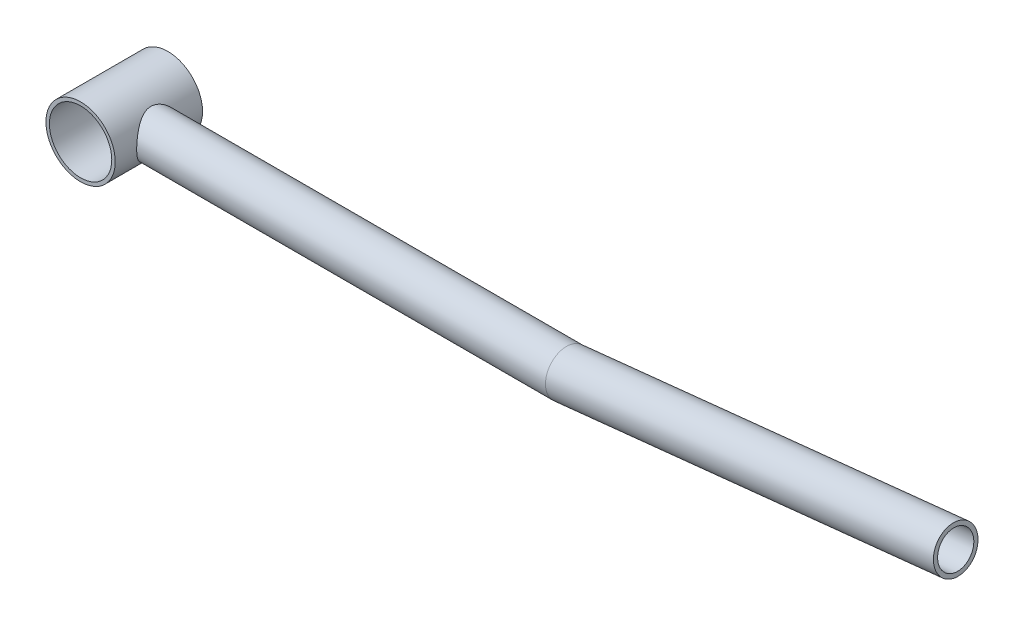
ISO-10303-21;
HEADER;
FILE_DESCRIPTION(('STEP AP214'),'2;1');
FILE_NAME('part.step','',(''),(''),'','','');
FILE_SCHEMA(('AUTOMOTIVE_DESIGN { 1 0 10303 214 1 1 1 1 }'));
ENDSEC;
DATA;
#1=APPLICATION_CONTEXT('core data for automotive mechanical design processes');
#2=APPLICATION_PROTOCOL_DEFINITION('international standard','automotive_design',2000,#1);
#3=PRODUCT_CONTEXT('',#1,'mechanical');
#4=PRODUCT('Part','Part','',(#3));
#5=PRODUCT_RELATED_PRODUCT_CATEGORY('part','',(#4));
#6=PRODUCT_DEFINITION_FORMATION('','',#4);
#7=PRODUCT_DEFINITION_CONTEXT('part definition',#1,'design');
#8=PRODUCT_DEFINITION('design','',#6,#7);
#9=PRODUCT_DEFINITION_SHAPE('','',#8);
#10=(LENGTH_UNIT() NAMED_UNIT(*) SI_UNIT(.MILLI.,.METRE.));
#11=(NAMED_UNIT(*) PLANE_ANGLE_UNIT() SI_UNIT($,.RADIAN.));
#12=(NAMED_UNIT(*) SI_UNIT($,.STERADIAN.) SOLID_ANGLE_UNIT());
#13=UNCERTAINTY_MEASURE_WITH_UNIT(LENGTH_MEASURE(1.E-05),#10,'distance_accuracy_value','');
#14=(GEOMETRIC_REPRESENTATION_CONTEXT(3) GLOBAL_UNCERTAINTY_ASSIGNED_CONTEXT((#13)) GLOBAL_UNIT_ASSIGNED_CONTEXT((#10,
#11,#12)) REPRESENTATION_CONTEXT('',''));
#15=CARTESIAN_POINT('',(0.,0.,0.));
#16=DIRECTION('',(0.,0.,1.));
#17=DIRECTION('',(1.,0.,0.));
#18=AXIS2_PLACEMENT_3D('',#15,#16,#17);
#19=CARTESIAN_POINT('',(0.,0.,-31.5));
#20=DIRECTION('',(0.,0.,1.));
#21=DIRECTION('',(1.,0.,0.));
#22=AXIS2_PLACEMENT_3D('',#19,#20,#21);
#23=CYLINDRICAL_SURFACE('',#22,22.5);
#24=CARTESIAN_POINT('',(0.,0.,-31.5));
#25=DIRECTION('',(0.,0.,1.));
#26=DIRECTION('',(1.,0.,0.));
#27=AXIS2_PLACEMENT_3D('',#24,#25,#26);
#28=CIRCLE('',#27,22.5);
#29=CARTESIAN_POINT('',(22.5,0.,-31.5));
#30=VERTEX_POINT('',#29);
#31=EDGE_CURVE('E67',#30,#30,#28,.T.);
#32=ORIENTED_EDGE('',*,*,#31,.F.);
#33=EDGE_LOOP('',(#32));
#34=FACE_BOUND('',#33,.T.);
#35=CARTESIAN_POINT('',(0.,0.,31.5));
#36=DIRECTION('',(0.,0.,1.));
#37=DIRECTION('',(1.,0.,0.));
#38=AXIS2_PLACEMENT_3D('',#35,#36,#37);
#39=CIRCLE('',#38,22.5);
#40=CARTESIAN_POINT('',(22.5,0.,31.5));
#41=VERTEX_POINT('',#40);
#42=EDGE_CURVE('E77',#41,#41,#39,.T.);
#43=ORIENTED_EDGE('',*,*,#42,.T.);
#44=EDGE_LOOP('',(#43));
#45=FACE_BOUND('',#44,.T.);
#46=ADVANCED_FACE('F65',(#34,#45),#23,.F.);
#47=CARTESIAN_POINT('',(0.,0.,31.5));
#48=DIRECTION('',(0.,0.,1.));
#49=DIRECTION('',(1.,0.,0.));
#50=AXIS2_PLACEMENT_3D('',#47,#48,#49);
#51=PLANE('',#50);
#52=CARTESIAN_POINT('',(0.,0.,31.5));
#53=DIRECTION('',(0.,0.,1.));
#54=DIRECTION('',(1.,0.,0.));
#55=AXIS2_PLACEMENT_3D('',#52,#53,#54);
#56=CIRCLE('',#55,25.);
#57=CARTESIAN_POINT('',(25.,0.,31.5));
#58=VERTEX_POINT('',#57);
#59=EDGE_CURVE('E74',#58,#58,#56,.T.);
#60=ORIENTED_EDGE('',*,*,#59,.T.);
#61=EDGE_LOOP('',(#60));
#62=FACE_BOUND('',#61,.T.);
#63=ORIENTED_EDGE('',*,*,#42,.F.);
#64=EDGE_LOOP('',(#63));
#65=FACE_BOUND('',#64,.T.);
#66=ADVANCED_FACE('F84',(#62,#65),#51,.T.);
#67=CARTESIAN_POINT('',(0.,0.,-31.5));
#68=DIRECTION('',(0.,0.,1.));
#69=DIRECTION('',(1.,0.,0.));
#70=AXIS2_PLACEMENT_3D('',#67,#68,#69);
#71=PLANE('',#70);
#72=ORIENTED_EDGE('',*,*,#31,.T.);
#73=EDGE_LOOP('',(#72));
#74=FACE_BOUND('',#73,.T.);
#75=CARTESIAN_POINT('',(0.,0.,-31.5));
#76=DIRECTION('',(0.,0.,1.));
#77=DIRECTION('',(1.,0.,0.));
#78=AXIS2_PLACEMENT_3D('',#75,#76,#77);
#79=CIRCLE('',#78,25.);
#80=CARTESIAN_POINT('',(25.,0.,-31.5));
#81=VERTEX_POINT('',#80);
#82=EDGE_CURVE('E12',#81,#81,#79,.T.);
#83=ORIENTED_EDGE('',*,*,#82,.F.);
#84=EDGE_LOOP('',(#83));
#85=FACE_BOUND('',#84,.T.);
#86=ADVANCED_FACE('F83',(#74,#85),#71,.F.);
#87=CARTESIAN_POINT('',(0.,0.,-31.5));
#88=DIRECTION('',(0.,0.,1.));
#89=DIRECTION('',(1.,0.,0.));
#90=AXIS2_PLACEMENT_3D('',#87,#88,#89);
#91=CYLINDRICAL_SURFACE('',#90,25.);
#92=ORIENTED_EDGE('',*,*,#59,.F.);
#93=EDGE_LOOP('',(#92));
#94=FACE_BOUND('',#93,.T.);
#95=ORIENTED_EDGE('',*,*,#82,.T.);
#96=EDGE_LOOP('',(#95));
#97=FACE_BOUND('',#96,.T.);
#98=ADVANCED_FACE('F95',(#94,#97),#91,.T.);
#99=CLOSED_SHELL('',(#46,#66,#86,#98));
#100=MANIFOLD_SOLID_BREP('B2',#99);
#101=CARTESIAN_POINT('',(0.,0.,-31.5));
#102=DIRECTION('',(0.,0.,1.));
#103=DIRECTION('',(1.,0.,0.));
#104=AXIS2_PLACEMENT_3D('',#101,#102,#103);
#105=CYLINDRICAL_SURFACE('',#104,25.);
#106=CARTESIAN_POINT('',(25.,0.,-16.));
#107=CARTESIAN_POINT('',(25.0000015619882,0.404925044071155,-16.0000018773157));
#108=CARTESIAN_POINT('',(24.990142097665,0.809832411815925,-15.9846099706385));
#109=CARTESIAN_POINT('',(24.9509510419688,1.61652618236299,-15.92326968288));
#110=CARTESIAN_POINT('',(24.9216122625561,2.01831137766445,-15.8773100220158));
#111=CARTESIAN_POINT('',(24.8441286420605,2.81604821037112,-15.7554098701401));
#112=CARTESIAN_POINT('',(24.7959565811092,3.21199053959218,-15.6794259832054));
#113=CARTESIAN_POINT('',(24.6819740036757,3.99456099671028,-15.4985408355827));
#114=CARTESIAN_POINT('',(24.6161648797958,4.38118985736234,-15.3936418579784));
#115=CARTESIAN_POINT('',(24.468785547579,5.14076609074118,-15.1568468243231));
#116=CARTESIAN_POINT('',(24.3872961899422,5.51377244407853,-15.025089059471));
#117=CARTESIAN_POINT('',(24.2100855842812,6.24609510158275,-14.7357159583602));
#118=CARTESIAN_POINT('',(24.114364104839,6.60541118302287,-14.5781002016396));
#119=CARTESIAN_POINT('',(23.9106324755014,7.30859986653979,-14.2385667901493));
#120=CARTESIAN_POINT('',(23.8026253610819,7.65247625422316,-14.0566551363675));
#121=CARTESIAN_POINT('',(23.5763254629354,8.32360019852906,-13.6699562899151));
#122=CARTESIAN_POINT('',(23.4580313681202,8.65084562706958,-13.4651661804078));
#123=CARTESIAN_POINT('',(23.2032751229575,9.31365412183653,-13.0164828623738));
#124=CARTESIAN_POINT('',(23.0661182340287,9.64771274316306,-12.7707619235136));
#125=CARTESIAN_POINT('',(22.7850064089794,10.2940617258666,-12.2557366535805));
#126=CARTESIAN_POINT('',(22.6410511668713,10.6063511058608,-11.9864312605261));
#127=CARTESIAN_POINT('',(22.3490022897849,11.2086687230747,-11.4252092234652));
#128=CARTESIAN_POINT('',(22.2009034973146,11.4986673651024,-11.1332635184821));
#129=CARTESIAN_POINT('',(21.9037344054836,12.0551203444099,-10.5282019106555));
#130=CARTESIAN_POINT('',(21.7546640715095,12.3215738378621,-10.2150852497817));
#131=CARTESIAN_POINT('',(21.4374499122155,12.8665793254927,-9.52219977657806));
#132=CARTESIAN_POINT('',(21.2696389657507,13.1413799496496,-9.1393143835168));
#133=CARTESIAN_POINT('',(20.9419379170098,13.6575524379486,-8.348316185452));
#134=CARTESIAN_POINT('',(20.7820494133894,13.8989175727052,-7.94019832587867));
#135=CARTESIAN_POINT('',(20.4759821659353,14.3459904698911,-7.10058524689527));
#136=CARTESIAN_POINT('',(20.3297848843603,14.5517467761611,-6.66912292284909));
#137=CARTESIAN_POINT('',(20.1252100289451,14.8320367864773,-6.00569055390516));
#138=CARTESIAN_POINT('',(20.0594794225192,14.9207331379766,-5.78186975362472));
#139=CARTESIAN_POINT('',(19.9336577942813,15.0884150598226,-5.32898189890081));
#140=CARTESIAN_POINT('',(19.8735682005868,15.16739817266,-5.09991353411017));
#141=CARTESIAN_POINT('',(19.7336948385013,15.3492623867947,-4.53055229253545));
#142=CARTESIAN_POINT('',(19.6575477076493,15.4464497728831,-4.1875138920204));
#143=CARTESIAN_POINT('',(19.521358473509,15.6182136002394,-3.49276536899717));
#144=CARTESIAN_POINT('',(19.4613122707708,15.6927957976356,-3.14105747877335));
#145=CARTESIAN_POINT('',(19.3594402998739,15.8183001813279,-2.43126972701606));
#146=CARTESIAN_POINT('',(19.3175916839816,15.8692520417559,-2.07319844663944));
#147=CARTESIAN_POINT('',(19.2535956523238,15.9468367737907,-1.35265801288986));
#148=CARTESIAN_POINT('',(19.231448454688,15.9734693761403,-0.990188810869154));
#149=CARTESIAN_POINT('',(19.2077129340946,16.0020035959886,-0.26246015615068));
#150=CARTESIAN_POINT('',(19.2061890356969,16.0038277150333,0.10280447537216));
#151=CARTESIAN_POINT('',(19.2239297577434,15.9825126443981,0.832091460399473));
#152=CARTESIAN_POINT('',(19.24319448145,15.9593733307183,1.19611380772419));
#153=CARTESIAN_POINT('',(19.3017467127909,15.8885074198918,1.92037328223284));
#154=CARTESIAN_POINT('',(19.3410485617405,15.8407632118421,2.28060750937627));
#155=CARTESIAN_POINT('',(19.4381624474468,15.7214419318028,2.99454239108447));
#156=CARTESIAN_POINT('',(19.4959748739967,15.6498643579324,3.34824290789736));
#157=CARTESIAN_POINT('',(19.6260739031015,15.4863735674023,4.03652558609995));
#158=CARTESIAN_POINT('',(19.6978709558272,15.3951393603922,4.37136256989055));
#159=CARTESIAN_POINT('',(19.8548252831694,15.1921818732877,5.03160397521626));
#160=CARTESIAN_POINT('',(19.9399877947337,15.0804505589621,5.35700463988336));
#161=CARTESIAN_POINT('',(20.2121658403417,14.7159808896165,6.31729900859783));
#162=CARTESIAN_POINT('',(20.415946958597,14.4338764142666,6.93665942019118));
#163=CARTESIAN_POINT('',(20.7627220180091,13.9270311591719,7.88670986628182));
#164=CARTESIAN_POINT('',(20.8971209302017,13.7249831568112,8.23315173665736));
#165=CARTESIAN_POINT('',(21.1722128751606,13.296696161189,8.90828480780034));
#166=CARTESIAN_POINT('',(21.3129064950319,13.0704549086854,9.23697434647771));
#167=CARTESIAN_POINT('',(21.5975435918726,12.5945655171766,9.87602455074263));
#168=CARTESIAN_POINT('',(21.741490387645,12.3448925721126,10.1863652117508));
#169=CARTESIAN_POINT('',(22.0295648350163,11.823159163581,10.7875537186817));
#170=CARTESIAN_POINT('',(22.1736924970079,11.5510973496357,11.0784003868203));
#171=CARTESIAN_POINT('',(22.4854503237815,10.9336594778248,11.6908990129197));
#172=CARTESIAN_POINT('',(22.6525676241315,10.5839664649272,12.0084814733917));
#173=CARTESIAN_POINT('',(22.9788334546104,9.85558430354046,12.6131505683738));
#174=CARTESIAN_POINT('',(23.1379806516688,9.47689033099584,12.9002321102804));
#175=CARTESIAN_POINT('',(23.4439951491246,8.6923014745235,13.4413788795508));
#176=CARTESIAN_POINT('',(23.5908728474814,8.28643015897211,13.695472166599));
#177=CARTESIAN_POINT('',(23.7989867549893,7.65877791158844,14.0499422909588));
#178=CARTESIAN_POINT('',(23.8663204968941,7.44643333273027,14.1636478233454));
#179=CARTESIAN_POINT('',(23.9964832307619,7.01565570471913,14.3818943973732));
#180=CARTESIAN_POINT('',(24.0593110591769,6.79722110303667,14.4864330734262));
#181=CARTESIAN_POINT('',(24.2163596379815,6.22117702909597,14.7461292462035));
#182=CARTESIAN_POINT('',(24.3066645830134,5.85907262264252,14.8937970331853));
#183=CARTESIAN_POINT('',(24.472571043401,5.12210088957013,15.1630462524395));
#184=CARTESIAN_POINT('',(24.5481752064179,4.74723587549779,15.2846323825156));
#185=CARTESIAN_POINT('',(24.6830408717459,3.98702789616474,15.5003093339703));
#186=CARTESIAN_POINT('',(24.7423124565402,3.60169155725471,15.5944171205238));
#187=CARTESIAN_POINT('',(24.8432233011495,2.82284294906272,15.7540335011103));
#188=CARTESIAN_POINT('',(24.8848622338729,2.42933052825373,15.8195415646094));
#189=CARTESIAN_POINT('',(24.9496239299749,1.63564062619806,15.9212210484698));
#190=CARTESIAN_POINT('',(24.9726833167174,1.23544504541874,15.9572920615261));
#191=CARTESIAN_POINT('',(24.999477761314,0.432822676299672,15.9991921444795));
#192=CARTESIAN_POINT('',(25.003212815007,0.0303958874795025,16.0050212078647));
#193=CARTESIAN_POINT('',(24.9912650807508,-0.773483996299121,15.9863498172394));
#194=CARTESIAN_POINT('',(24.9755811323802,-1.17493703163257,15.9618475507195));
#195=CARTESIAN_POINT('',(24.9251836971058,-1.97366097901498,15.8828746268655));
#196=CARTESIAN_POINT('',(24.8904707030591,-2.37093199910756,15.8284047456999));
#197=CARTESIAN_POINT('',(24.8052000041332,-3.13731209509082,15.6939634497678));
#198=CARTESIAN_POINT('',(24.7555850388601,-3.5067938890072,15.6155053701039));
#199=CARTESIAN_POINT('',(24.6411050211604,-4.23704308721497,15.4333752681049));
#200=CARTESIAN_POINT('',(24.5762406334449,-4.59781087058805,15.3297043447724));
#201=CARTESIAN_POINT('',(24.4325489543541,-5.30867908099268,15.098267274378));
#202=CARTESIAN_POINT('',(24.3537207449646,-5.65877880490658,14.9704995431003));
#203=CARTESIAN_POINT('',(24.1835862363121,-6.34662960165231,14.6921060234087));
#204=CARTESIAN_POINT('',(24.092279251275,-6.68437999452995,14.5414789787058));
#205=CARTESIAN_POINT('',(23.8916275742825,-7.37070229752059,14.2066584791477));
#206=CARTESIAN_POINT('',(23.7814473707268,-7.71821923165125,14.0208041517277));
#207=CARTESIAN_POINT('',(23.5506783083944,-8.39605638651571,13.6257168103069));
#208=CARTESIAN_POINT('',(23.430089041497,-8.72637593215577,13.4164828795388));
#209=CARTESIAN_POINT('',(23.180630204464,-9.36895085200485,12.9759241468037));
#210=CARTESIAN_POINT('',(23.0517555610962,-9.68119493171721,12.7445857670566));
#211=CARTESIAN_POINT('',(22.7880601838735,-10.2865613887257,12.2611877169459));
#212=CARTESIAN_POINT('',(22.6532388486398,-10.5796818246151,12.0091259486241));
#213=CARTESIAN_POINT('',(22.3591293702995,-11.1893099340712,11.4453931745428));
#214=CARTESIAN_POINT('',(22.1992483653671,-11.5025558397825,11.1304967694322));
#215=CARTESIAN_POINT('',(21.8784405932856,-12.1016246389837,10.4760453865055));
#216=CARTESIAN_POINT('',(21.7175136803215,-12.3874436172205,10.1364869002433));
#217=CARTESIAN_POINT('',(21.3985808420018,-12.9305814468634,9.43383774878561));
#218=CARTESIAN_POINT('',(21.2405756556402,-13.1878931678842,9.07074123197174));
#219=CARTESIAN_POINT('',(20.9318561584343,-13.6725981697188,8.32218851305902));
#220=CARTESIAN_POINT('',(20.7811407458473,-13.8999959805734,7.93673570927365));
#221=CARTESIAN_POINT('',(20.511424857198,-14.2944225726149,7.19860411557444));
#222=CARTESIAN_POINT('',(20.3909016210024,-14.4654551193313,6.84861937048305));
#223=CARTESIAN_POINT('',(20.1620574047653,-14.7827501975162,6.1337720024687));
#224=CARTESIAN_POINT('',(20.0537340572625,-14.9290175376039,5.76891228490504));
#225=CARTESIAN_POINT('',(19.8527690015487,-15.1952420148147,5.02594698508987));
#226=CARTESIAN_POINT('',(19.7601104179272,-15.315227506719,4.64785619353897));
#227=CARTESIAN_POINT('',(19.5936975313565,-15.5275641940392,3.87987504664825));
#228=CARTESIAN_POINT('',(19.5199429946438,-15.6199157311731,3.48998483728421));
#229=CARTESIAN_POINT('',(19.3938056687495,-15.7762650376,2.69708614747012));
#230=CARTESIAN_POINT('',(19.3416363723446,-15.8399800811272,2.29398728836183));
#231=CARTESIAN_POINT('',(19.2621898317533,-15.9364986807434,1.48164477784623));
#232=CARTESIAN_POINT('',(19.2349119436678,-15.9693030364411,1.07240128566871));
#233=CARTESIAN_POINT('',(19.2066524645509,-16.0032809353728,0.251937882014706));
#234=CARTESIAN_POINT('',(19.2056547442586,-16.0044738798821,-0.159280662259528));
#235=CARTESIAN_POINT('',(19.2299728056356,-15.9752468012828,-0.979782619212487));
#236=CARTESIAN_POINT('',(19.2552864904598,-15.9448292973183,-1.38906618348532));
#237=CARTESIAN_POINT('',(19.3254345723058,-15.8596997261339,-2.14298597707889));
#238=CARTESIAN_POINT('',(19.3669198547315,-15.8091331210736,-2.48841817165343));
#239=CARTESIAN_POINT('',(19.4667172401765,-15.6860828655746,-3.17297476292449));
#240=CARTESIAN_POINT('',(19.5250341268026,-15.6135929841754,-3.51209733719601));
#241=CARTESIAN_POINT('',(19.6566579347328,-15.4475564981701,-4.18238074207572));
#242=CARTESIAN_POINT('',(19.7299743789902,-15.3539965127064,-4.51353636459322));
#243=CARTESIAN_POINT('',(19.8894647238651,-15.1468238889593,-5.16633733479859));
#244=CARTESIAN_POINT('',(19.9756403612109,-15.0332085416725,-5.48798139083823));
#245=CARTESIAN_POINT('',(20.1902486625657,-14.7443693949179,-6.2299347962595));
#246=CARTESIAN_POINT('',(20.3230031980176,-14.5614134998205,-6.64600179716923));
#247=CARTESIAN_POINT('',(20.6025569184015,-14.1631148541737,-7.45724147650318));
#248=CARTESIAN_POINT('',(20.7493557588791,-13.9477728978597,-7.85241466700576));
#249=CARTESIAN_POINT('',(21.0523136209136,-13.4861556789325,-8.62118734138439));
#250=CARTESIAN_POINT('',(21.2084841630588,-13.239841918056,-8.99475911587269));
#251=CARTESIAN_POINT('',(21.5254932104697,-12.7179541719606,-9.71868049711563));
#252=CARTESIAN_POINT('',(21.6863313712946,-12.4423823418331,-10.0690318111599));
#253=CARTESIAN_POINT('',(22.010442238798,-11.859716150561,-10.7494224070127));
#254=CARTESIAN_POINT('',(22.1737212606611,-11.5522878757903,-11.0791728601149));
#255=CARTESIAN_POINT('',(22.4968024507648,-10.9097759508097,-11.7123977011906));
#256=CARTESIAN_POINT('',(22.6566045458943,-10.5746917197737,-12.0158715370322));
#257=CARTESIAN_POINT('',(22.9689581645052,-9.87788824812158,-12.5949385398338));
#258=CARTESIAN_POINT('',(23.1215088222784,-9.51616584039965,-12.8705283822917));
#259=CARTESIAN_POINT('',(23.3420621846537,-8.95480859407571,-13.2613498914431));
#260=CARTESIAN_POINT('',(23.4142021245946,-8.7645578626101,-13.3878647497722));
#261=CARTESIAN_POINT('',(23.5553237080331,-8.37789362684306,-13.6331707030461));
#262=CARTESIAN_POINT('',(23.6243041595969,-8.18147784307572,-13.7519588900481));
#263=CARTESIAN_POINT('',(23.8300744697518,-7.57072389698192,-14.1035237172432));
#264=CARTESIAN_POINT('',(23.9609814020929,-7.14672497942358,-14.323210508379));
#265=CARTESIAN_POINT('',(24.2035792788676,-6.27620668494686,-14.7254539287129));
#266=CARTESIAN_POINT('',(24.3152735453922,-5.8296912187004,-14.9080169780295));
#267=CARTESIAN_POINT('',(24.4657106327018,-5.14619804504747,-15.1517335983943));
#268=CARTESIAN_POINT('',(24.5129636821995,-4.91633650685716,-15.2278849584961));
#269=CARTESIAN_POINT('',(24.6014604241758,-4.45240645515486,-15.3699361290149));
#270=CARTESIAN_POINT('',(24.6427057539856,-4.21833910749467,-15.4358387329389));
#271=CARTESIAN_POINT('',(24.756860888756,-3.51078593222696,-15.6176557338748));
#272=CARTESIAN_POINT('',(24.8202802251292,-3.03154239159498,-15.7178247777842));
#273=CARTESIAN_POINT('',(24.912855714342,-2.1278497380044,-15.8635762871447));
#274=CARTESIAN_POINT('',(24.9454536896083,-1.7046181764861,-15.9146575501143));
#275=CARTESIAN_POINT('',(24.989025253133,-0.854251246410949,-15.982868800304));
#276=CARTESIAN_POINT('',(24.9999983524116,-0.427115789798946,-15.9999980198034));
#277=CARTESIAN_POINT('',(25.,0.,-16.));
#278=B_SPLINE_CURVE_WITH_KNOTS('',3,(#106,#107,#108,#109,#110,#111,#112,#113,#114,#115,#116,
#117,#118,#119,#120,#121,#122,#123,#124,#125,#126,#127,#128,#129,#130,#131,#132,#133,#134,#135,
#136,#137,#138,#139,#140,#141,#142,#143,#144,#145,#146,#147,#148,#149,#150,#151,#152,#153,#154,
#155,#156,#157,#158,#159,#160,#161,#162,#163,#164,#165,#166,#167,#168,#169,#170,#171,#172,#173,
#174,#175,#176,#177,#178,#179,#180,#181,#182,#183,#184,#185,#186,#187,#188,#189,#190,#191,#192,
#193,#194,#195,#196,#197,#198,#199,#200,#201,#202,#203,#204,#205,#206,#207,#208,#209,#210,#211,
#212,#213,#214,#215,#216,#217,#218,#219,#220,#221,#222,#223,#224,#225,#226,#227,#228,#229,#230,
#231,#232,#233,#234,#235,#236,#237,#238,#239,#240,#241,#242,#243,#244,#245,#246,#247,#248,#249,
#250,#251,#252,#253,#254,#255,#256,#257,#258,#259,#260,#261,#262,#263,#264,#265,#266,#267,#268,
#269,#270,#271,#272,#273,#274,#275,#276,#277),.UNSPECIFIED.,.T.,.F.,(4,2,2,2,2,2,2,2,2,2,2,2,2,
2,2,2,2,2,2,2,2,2,2,2,2,2,2,2,2,2,2,2,2,2,2,2,2,2,2,2,2,2,2,2,2,2,2,2,2,2,2,2,2,2,2,2,2,2,2,2,2,
2,2,2,2,2,2,2,2,2,2,2,2,2,2,2,2,2,2,2,2,2,2,2,2,4),(0.,1.21433590372909,2.42912015739384,
3.64566667645103,4.86211716668029,6.07245576879059,7.28281405347461,8.49287393554705,
9.70308826789617,11.0121682302353,12.3213071693168,13.6321552474755,14.9430502856901,
16.4420715483407,17.9413940741466,19.4386562617971,20.1870950354631,20.9357227808739,
22.0283192451477,23.120637259216,24.2115798402962,25.3025344998955,26.3968963790282,
27.4912636941612,28.5864153906037,29.6815901501144,30.7437087697947,31.8062446000701,
33.9301496941282,35.1981954835546,36.4663597906896,37.7358821242905,39.0054810906213,
40.5068568446586,42.0084828841258,43.5088231589307,44.258900518937,45.0091708768569,
46.2118707177269,47.4143537471899,48.6160927841587,49.8178541128161,51.0236976145029,
52.2295413758452,53.4354571982781,54.6413417886698,55.7829773658005,56.9245631890967,
58.0662240907687,59.2079477579223,60.4343408374661,61.6607820235585,62.8879814611388,
64.1153052891324,65.5300085169597,66.9449133972259,68.3601713857365,69.775214806001,
70.997381541078,72.2193106972438,73.4399149816459,74.6605041715842,75.8928927793549,
77.1252495063834,78.3568498658442,79.5883520824207,80.6419106900126,81.6957690183668,
82.7502985106615,83.8049705540183,85.2234889733917,86.6419726107124,88.0622371979518,
89.4823972438031,90.9193332530907,92.3562994483688,93.7934367662636,94.5120249362064,
95.2308820013993,96.7140532599454,98.1969678027555,98.9368252382388,99.6764806557275,
101.154474230587,102.435329338598,103.716213408864),.UNSPECIFIED.);
#279=CARTESIAN_POINT('',(25.,0.,-16.));
#280=VERTEX_POINT('',#279);
#281=EDGE_CURVE('E153',#280,#280,#278,.T.);
#282=ORIENTED_EDGE('',*,*,#281,.F.);
#283=EDGE_LOOP('',(#282));
#284=FACE_BOUND('',#283,.T.);
#285=CARTESIAN_POINT('',(25.,0.,-13.));
#286=CARTESIAN_POINT('',(25.0000001702951,0.340204341556733,-13.0000002605469));
#287=CARTESIAN_POINT('',(24.9930404339722,0.680407398946641,-12.9866312335494));
#288=CARTESIAN_POINT('',(24.9653795457232,1.35828658290206,-12.9333172013221));
#289=CARTESIAN_POINT('',(24.9446731560876,1.69596169666539,-12.893362066318));
#290=CARTESIAN_POINT('',(24.8900097902791,2.36659610841477,-12.7872848172593));
#291=CARTESIAN_POINT('',(24.8560330742241,2.69954761172962,-12.721123719216));
#292=CARTESIAN_POINT('',(24.7756947044239,3.35781135937106,-12.5634249675728));
#293=CARTESIAN_POINT('',(24.7293341095554,3.68312425424667,-12.4718894835708));
#294=CARTESIAN_POINT('',(24.6255688554872,4.32272079072737,-12.2648533671199));
#295=CARTESIAN_POINT('',(24.5682093410991,4.63704351161458,-12.1494505505017));
#296=CARTESIAN_POINT('',(24.4436597947735,5.25419927223117,-11.8955762989639));
#297=CARTESIAN_POINT('',(24.3764695871903,5.55703210654805,-11.7571044518618));
#298=CARTESIAN_POINT('',(24.233778217634,6.14953905610845,-11.4583255812009));
#299=CARTESIAN_POINT('',(24.1582797305099,6.43921736426612,-11.2980255812887));
#300=CARTESIAN_POINT('',(24.000540363323,7.00429583712105,-10.9566807261633));
#301=CARTESIAN_POINT('',(23.9182968241315,7.27969030011877,-10.7756276781));
#302=CARTESIAN_POINT('',(23.7434002492631,7.83199229786596,-10.3818175128945));
#303=CARTESIAN_POINT('',(23.6504178454092,8.1078797895396,-10.1677757714221));
#304=CARTESIAN_POINT('',(23.460929538733,8.64087979600847,-9.71887936079744));
#305=CARTESIAN_POINT('',(23.3644234157451,8.8979911346285,-9.48402338983738));
#306=CARTESIAN_POINT('',(23.1700602079765,9.39249366090153,-8.99456329897706));
#307=CARTESIAN_POINT('',(23.0722022491853,9.62987132027777,-8.73994585923708));
#308=CARTESIAN_POINT('',(22.8775106421765,10.0836744087497,-8.21222552962048));
#309=CARTESIAN_POINT('',(22.7806771966092,10.3000957592059,-7.93911905880446));
#310=CARTESIAN_POINT('',(22.5822888490217,10.7284964327013,-7.35137491450091));
#311=CARTESIAN_POINT('',(22.4810432465619,10.93849600624,-7.03518507315836));
#312=CARTESIAN_POINT('',(22.2858801591023,11.3308229951789,-6.38410817370182));
#313=CARTESIAN_POINT('',(22.1919595696191,11.5131621649045,-6.04922914080868));
#314=CARTESIAN_POINT('',(22.0146986809145,11.8485879046015,-5.3625469574605));
#315=CARTESIAN_POINT('',(21.9313549724186,12.0016839086796,-5.01074931110416));
#316=CARTESIAN_POINT('',(21.7784580170517,12.2769537883593,-4.29235509486164));
#317=CARTESIAN_POINT('',(21.7089031203845,12.3991313637561,-3.9257603017412));
#318=CARTESIAN_POINT('',(21.590350086538,12.604362918756,-3.20346421783528));
#319=CARTESIAN_POINT('',(21.5403502422915,12.6893619783101,-2.84848107070403));
#320=CARTESIAN_POINT('',(21.4572325913045,12.8294128842363,-2.13068849042817));
#321=CARTESIAN_POINT('',(21.4241140048536,12.8844661137523,-1.76787941955375));
#322=CARTESIAN_POINT('',(21.3762742604351,12.9636820658165,-1.0380492712759));
#323=CARTESIAN_POINT('',(21.3615350976161,12.987875020242,-0.671032672008512));
#324=CARTESIAN_POINT('',(21.3510919525863,13.005037294253,0.0639829049790524));
#325=CARTESIAN_POINT('',(21.3553858749057,12.9980100510628,0.431981770097356));
#326=CARTESIAN_POINT('',(21.3809744361808,12.9558632471136,1.11682419553321));
#327=CARTESIAN_POINT('',(21.3999471184325,12.9245793432344,1.4340005108586));
#328=CARTESIAN_POINT('',(21.4513850657515,12.8390254131686,2.06409467935647));
#329=CARTESIAN_POINT('',(21.4838489251264,12.7847577817246,2.37701297268));
#330=CARTESIAN_POINT('',(21.5612000109803,12.6538695805646,2.99664852968667));
#331=CARTESIAN_POINT('',(21.6060908900215,12.5772424385599,3.30336394172773));
#332=CARTESIAN_POINT('',(21.7068912451888,12.4024608935271,3.9087384870059));
#333=CARTESIAN_POINT('',(21.7628013482352,12.3043052656362,4.20739716076884));
#334=CARTESIAN_POINT('',(21.8854021362748,12.0849206332374,4.8018042893791));
#335=CARTESIAN_POINT('',(21.9523083659046,11.9632192653028,5.0973335142671));
#336=CARTESIAN_POINT('',(22.0941388090986,11.6992085742153,5.67715063863965));
#337=CARTESIAN_POINT('',(22.1690658722147,11.5568919207107,5.96143449354397));
#338=CARTESIAN_POINT('',(22.3250447451085,11.2526262769882,6.51758307972452));
#339=CARTESIAN_POINT('',(22.4060974611472,11.0906743796801,6.78944596379373));
#340=CARTESIAN_POINT('',(22.5724495904422,10.7480596754282,7.31976006889719));
#341=CARTESIAN_POINT('',(22.6577493696674,10.5673952545739,7.5782101302172));
#342=CARTESIAN_POINT('',(22.8427910876144,10.1618510404295,8.11574601244612));
#343=CARTESIAN_POINT('',(22.9428928684983,9.93431563042469,8.39270922645552));
#344=CARTESIAN_POINT('',(23.1435765880187,9.45736642762499,8.92672110387884));
#345=CARTESIAN_POINT('',(23.2441583542524,9.20796000234884,9.18377641898065));
#346=CARTESIAN_POINT('',(23.4434247189346,8.68811741226983,9.67704045788495));
#347=CARTESIAN_POINT('',(23.5421074282718,8.41766153341611,9.9132291860263));
#348=CARTESIAN_POINT('',(23.7350166282809,7.85727444054331,10.3630243896245));
#349=CARTESIAN_POINT('',(23.8292448700257,7.56735098964692,10.5766397802582));
#350=CARTESIAN_POINT('',(24.0159165363006,6.95300766906358,10.9909184267306));
#351=CARTESIAN_POINT('',(24.107984050306,6.62756919158452,11.1902450383258));
#352=CARTESIAN_POINT('',(24.2820551849578,5.9582999801499,11.5604889540311));
#353=CARTESIAN_POINT('',(24.3640582711835,5.61446827090567,11.7314047496994));
#354=CARTESIAN_POINT('',(24.51554963582,4.91092630347302,12.0428685124475));
#355=CARTESIAN_POINT('',(24.5850464379466,4.55122706965031,12.1834371759035));
#356=CARTESIAN_POINT('',(24.7094575033801,3.81847311593513,12.4325762872155));
#357=CARTESIAN_POINT('',(24.764373598923,3.44542008079598,12.5411507557045));
#358=CARTESIAN_POINT('',(24.8537932635497,2.72212497978345,12.7167694571386));
#359=CARTESIAN_POINT('',(24.8896586556958,2.37272818848612,12.7866083425198));
#360=CARTESIAN_POINT('',(24.9467822310975,1.66820731481846,12.8974497531458));
#361=CARTESIAN_POINT('',(24.9680412454699,1.31308355949485,12.9384539191166));
#362=CARTESIAN_POINT('',(24.9953372145888,0.600241534170011,12.9910502626928));
#363=CARTESIAN_POINT('',(25.0013810001355,0.242524500772237,13.0026556387511));
#364=CARTESIAN_POINT('',(24.9980897956797,-0.472568281323067,12.99632664635));
#365=CARTESIAN_POINT('',(24.9887555999268,-0.82994404669271,12.9783938034953));
#366=CARTESIAN_POINT('',(24.9564294026082,-1.51086986057756,12.9160363818725));
#367=CARTESIAN_POINT('',(24.9346722094452,-1.83470159127867,12.874005674287));
#368=CARTESIAN_POINT('',(24.8790511939545,-2.47725396176569,12.7659443902138));
#369=CARTESIAN_POINT('',(24.8451882289765,-2.79597496183174,12.6999155133084));
#370=CARTESIAN_POINT('',(24.766139501782,-3.42625621540584,12.5445658477684));
#371=CARTESIAN_POINT('',(24.7209531438575,-3.73781609123527,12.455243833704));
#372=CARTESIAN_POINT('',(24.620271024918,-4.35190563007044,12.2541957081568));
#373=CARTESIAN_POINT('',(24.5647748219534,-4.65443490531804,12.1424686362255));
#374=CARTESIAN_POINT('',(24.4430747160215,-5.25670774338669,11.8943640239742));
#375=CARTESIAN_POINT('',(24.3766257963242,-5.55616446405636,11.7574111401165));
#376=CARTESIAN_POINT('',(24.235571517543,-6.14230861228999,11.462100648081));
#377=CARTESIAN_POINT('',(24.160966102937,-6.42899595291273,11.3037428941963));
#378=CARTESIAN_POINT('',(24.0051505936542,-6.9883511171739,10.9667487395541));
#379=CARTESIAN_POINT('',(23.9239396018854,-7.26101702835159,10.7881095831064));
#380=CARTESIAN_POINT('',(23.7565432995598,-7.7912768270229,10.4116180028173));
#381=CARTESIAN_POINT('',(23.6703560606782,-8.04886479279928,10.2137581102827));
#382=CARTESIAN_POINT('',(23.4856292873879,-8.57382447843012,9.77842372644104));
#383=CARTESIAN_POINT('',(23.3867367033098,-8.83943245109512,9.53896920244068));
#384=CARTESIAN_POINT('',(23.1874314036334,-9.34976393439362,9.03932821288056));
#385=CARTESIAN_POINT('',(23.087018607203,-9.59448632988302,8.77914064175318));
#386=CARTESIAN_POINT('',(22.8871105162471,-10.0620507857229,8.2391010030577));
#387=CARTESIAN_POINT('',(22.7876159414733,-10.2848768169047,7.95923478314296));
#388=CARTESIAN_POINT('',(22.5922160982304,-10.7072846739721,7.3812070601214));
#389=CARTESIAN_POINT('',(22.4963114881582,-10.9068622501451,7.08304222727231));
#390=CARTESIAN_POINT('',(22.3052612916402,-11.2926700415265,6.451403681382));
#391=CARTESIAN_POINT('',(22.2105044123059,-11.4773872953771,6.1168847572444));
#392=CARTESIAN_POINT('',(22.0314241505524,-11.8174996336922,5.43076621664571));
#393=CARTESIAN_POINT('',(21.9470956849842,-11.9729090233135,5.07917503907675));
#394=CARTESIAN_POINT('',(21.7921499120258,-12.2526641292615,4.36124897558942));
#395=CARTESIAN_POINT('',(21.7215207642574,-12.377036697733,3.99492715508161));
#396=CARTESIAN_POINT('',(21.5969433215622,-12.5931589215534,3.25002493305169));
#397=CARTESIAN_POINT('',(21.5429922017513,-12.6849141019516,2.87144661951826));
#398=CARTESIAN_POINT('',(21.458656255754,-12.8270106514004,2.14284735768918));
#399=CARTESIAN_POINT('',(21.4264839078581,-12.8805224532802,1.7936502523392));
#400=CARTESIAN_POINT('',(21.379131441302,-12.9589685363216,1.09091304279845));
#401=CARTESIAN_POINT('',(21.3639501228917,-12.9839048352254,0.737373247030946));
#402=CARTESIAN_POINT('',(21.3512436401535,-13.0047892794407,0.0292937173007646));
#403=CARTESIAN_POINT('',(21.353709943799,-13.0007514327662,-0.325245450633362));
#404=CARTESIAN_POINT('',(21.3761714806744,-12.9637865667989,-1.03223989775404));
#405=CARTESIAN_POINT('',(21.396165753968,-12.9308611295632,-1.38469528999643));
#406=CARTESIAN_POINT('',(21.4496636217354,-12.8418949370052,-2.04554774962073));
#407=CARTESIAN_POINT('',(21.4814218176075,-12.7888248333194,-2.35449361268844));
#408=CARTESIAN_POINT('',(21.5570744817718,-12.660887077032,-2.96642394793688));
#409=CARTESIAN_POINT('',(21.6009729128323,-12.5860123066123,-3.26940643892692));
#410=CARTESIAN_POINT('',(21.6995564155728,-12.4152708585043,-3.86752848418103));
#411=CARTESIAN_POINT('',(21.7542399509385,-12.3194071704271,-4.16266914870925));
#412=CARTESIAN_POINT('',(21.872881341172,-12.1075101087353,-4.74382916806472));
#413=CARTESIAN_POINT('',(21.9368433471054,-11.9914677027854,-5.02984437003914));
#414=CARTESIAN_POINT('',(22.0768297233598,-11.7318682722637,-5.60988023012106));
#415=CARTESIAN_POINT('',(22.1533706935299,-11.5870037827014,-5.90319069504466));
#416=CARTESIAN_POINT('',(22.3130439293901,-11.276459878479,-6.47671356216472));
#417=CARTESIAN_POINT('',(22.3961768302113,-11.1107784572109,-6.7569246980991));
#418=CARTESIAN_POINT('',(22.5670204078958,-10.7595414794189,-7.30327110023385));
#419=CARTESIAN_POINT('',(22.6547326813815,-10.5739789672015,-7.56940139107631));
#420=CARTESIAN_POINT('',(22.8327264881963,-10.1839365904835,-8.08655407978648));
#421=CARTESIAN_POINT('',(22.9230084116758,-9.97945384259803,-8.33757416525306));
#422=CARTESIAN_POINT('',(23.1164830455052,-9.52352561271495,-8.85648613197401));
#423=CARTESIAN_POINT('',(23.219768022535,-9.26947070294956,-9.12205735890899));
#424=CARTESIAN_POINT('',(23.4243933460745,-8.73947735701812,-9.63101678327242));
#425=CARTESIAN_POINT('',(23.5257342602795,-8.46354543390262,-9.87441153687168));
#426=CARTESIAN_POINT('',(23.7239792256241,-7.89079880664007,-10.337847726548));
#427=CARTESIAN_POINT('',(23.8208795085084,-7.59396688960537,-10.5578695299559));
#428=CARTESIAN_POINT('',(24.0076380669776,-6.98111137888993,-10.9727387630882));
#429=CARTESIAN_POINT('',(24.0974966782235,-6.66508870126708,-11.1675873930506));
#430=CARTESIAN_POINT('',(24.2692315944733,-6.01006918147809,-11.5335229619459));
#431=CARTESIAN_POINT('',(24.3509477398867,-5.67077478852975,-11.7041537955042));
#432=CARTESIAN_POINT('',(24.5023182857669,-4.97621533174356,-12.0159136870259));
#433=CARTESIAN_POINT('',(24.5719710042035,-4.62094804945515,-12.1570386314854));
#434=CARTESIAN_POINT('',(24.6969643435948,-3.89797268937789,-12.4077326955316));
#435=CARTESIAN_POINT('',(24.7523391963354,-3.53029680338436,-12.517377363504));
#436=CARTESIAN_POINT('',(24.8472364755222,-2.78493029451918,-12.7040006084791));
#437=CARTESIAN_POINT('',(24.8867680603096,-2.40724559234941,-12.7809980589915));
#438=CARTESIAN_POINT('',(24.9449332055132,-1.69199000088584,-12.8938631665673));
#439=CARTESIAN_POINT('',(24.9655366753396,-1.35518744065162,-12.9336199803951));
#440=CARTESIAN_POINT('',(24.9930701432862,-0.678922867675735,-12.9866885681844));
#441=CARTESIAN_POINT('',(24.9999998300771,-0.339460794558049,-12.9999997400226));
#442=CARTESIAN_POINT('',(25.,0.,-13.));
#443=B_SPLINE_CURVE_WITH_KNOTS('',3,(#285,#286,#287,#288,#289,#290,#291,#292,#293,#294,#295,
#296,#297,#298,#299,#300,#301,#302,#303,#304,#305,#306,#307,#308,#309,#310,#311,#312,#313,#314,
#315,#316,#317,#318,#319,#320,#321,#322,#323,#324,#325,#326,#327,#328,#329,#330,#331,#332,#333,
#334,#335,#336,#337,#338,#339,#340,#341,#342,#343,#344,#345,#346,#347,#348,#349,#350,#351,#352,
#353,#354,#355,#356,#357,#358,#359,#360,#361,#362,#363,#364,#365,#366,#367,#368,#369,#370,#371,
#372,#373,#374,#375,#376,#377,#378,#379,#380,#381,#382,#383,#384,#385,#386,#387,#388,#389,#390,
#391,#392,#393,#394,#395,#396,#397,#398,#399,#400,#401,#402,#403,#404,#405,#406,#407,#408,#409,
#410,#411,#412,#413,#414,#415,#416,#417,#418,#419,#420,#421,#422,#423,#424,#425,#426,#427,#428,
#429,#430,#431,#432,#433,#434,#435,#436,#437,#438,#439,#440,#441,#442),.UNSPECIFIED.,.T.,.F.,(4,
2,2,2,2,2,2,2,2,2,2,2,2,2,2,2,2,2,2,2,2,2,2,2,2,2,2,2,2,2,2,2,2,2,2,2,2,2,2,2,2,2,2,2,2,2,2,2,2,
2,2,2,2,2,2,2,2,2,2,2,2,2,2,2,2,2,2,2,2,2,2,2,2,2,2,2,2,2,4),(0.,1.02027955621733,
2.04094807964387,3.06314068652988,4.08524591935982,5.10324242636784,6.12125712422274,
7.13894502604927,8.15703608159867,9.23994800268312,10.3229277014172,11.4066438093925,
12.4905704143802,13.6676387916424,14.8442055624167,16.0203921187716,17.196437862361,
18.300103827557,19.4037188120811,20.5062518217764,21.608663449819,22.5653716520829,
23.5219801965972,24.4788702075453,25.435814674862,26.4144394568528,27.393413074846,
28.3725318118937,29.3517350660209,30.4669990689226,31.5818888141925,32.6978355834278,
33.8133399572275,34.9895241711449,36.165770813371,37.3412127176668,38.5165068439744,
39.5893777890352,40.6621876816651,41.7345158557516,42.8067886474353,43.7874643148559,
44.7680705430483,45.7487283704161,46.7294282451155,47.7361463333856,48.7428712749185,
49.7497331670251,50.7569878772616,51.8688862899063,52.9808440330751,54.093609810584,
55.2065786785127,56.386135729167,57.5651155398432,58.7430717676458,59.920828366621,
60.9835114624635,62.0461195166646,63.1082138706398,64.1702500616156,65.1144289640875,
66.0589164262576,67.0032694453127,67.9480462659937,68.9549450451932,69.9619409570316,
70.9692903389222,71.9767934913617,73.1207737480393,74.264414697733,75.4090088041606,
76.5535483170498,77.7173883760496,78.8813905814238,80.0425755329626,81.2030882797357,
82.2211147452769,83.2391643893228),.UNSPECIFIED.);
#444=CARTESIAN_POINT('',(25.,0.,-13.));
#445=VERTEX_POINT('',#444);
#446=EDGE_CURVE('E140',#445,#445,#443,.T.);
#447=ORIENTED_EDGE('',*,*,#446,.T.);
#448=EDGE_LOOP('',(#447));
#449=FACE_BOUND('',#448,.T.);
#450=ADVANCED_FACE('F134',(#284,#449),#105,.F.);
#451=CARTESIAN_POINT('',(600.,29.4291858743897,0.));
#452=DIRECTION('',(-0.994521895368273,-0.104528463267654,0.));
#453=DIRECTION('',(0.104528463267654,-0.994521895368273,0.));
#454=AXIS2_PLACEMENT_3D('',#451,#452,#453);
#455=PLANE('',#454);
#456=CARTESIAN_POINT('',(600.,29.4291858743896,0.));
#457=DIRECTION('',(-0.994521895368273,-0.104528463267654,0.));
#458=DIRECTION('',(0.104528463267654,-0.994521895368273,0.));
#459=AXIS2_PLACEMENT_3D('',#456,#457,#458);
#460=CIRCLE('',#459,13.);
#461=CARTESIAN_POINT('',(601.35887002248,16.500401234602,0.));
#462=VERTEX_POINT('',#461);
#463=EDGE_CURVE('E62',#462,#462,#460,.T.);
#464=ORIENTED_EDGE('',*,*,#463,.T.);
#465=EDGE_LOOP('',(#464));
#466=FACE_BOUND('',#465,.T.);
#467=CARTESIAN_POINT('',(600.,29.4291858743897,0.));
#468=DIRECTION('',(-0.994521895368273,-0.104528463267654,0.));
#469=DIRECTION('',(0.104528463267654,-0.994521895368273,0.));
#470=AXIS2_PLACEMENT_3D('',#467,#468,#469);
#471=CIRCLE('',#470,16.);
#472=CARTESIAN_POINT('',(601.672455412283,13.5168355484973,0.));
#473=VERTEX_POINT('',#472);
#474=EDGE_CURVE('E151',#473,#473,#471,.T.);
#475=ORIENTED_EDGE('',*,*,#474,.F.);
#476=EDGE_LOOP('',(#475));
#477=FACE_BOUND('',#476,.T.);
#478=ADVANCED_FACE('F178',(#466,#477),#455,.F.);
#479=CARTESIAN_POINT('',(319.155222029483,-0.0887897425605293,0.));
#480=DIRECTION('',(0.994521895368273,0.104528463267654,0.));
#481=DIRECTION('',(-0.104528463267654,0.994521895368273,0.));
#482=AXIS2_PLACEMENT_3D('',#479,#480,#481);
#483=CYLINDRICAL_SURFACE('',#482,13.);
#484=ORIENTED_EDGE('',*,*,#463,.F.);
#485=EDGE_LOOP('',(#484));
#486=FACE_BOUND('',#485,.T.);
#487=CARTESIAN_POINT('',(320.,0.,0.));
#488=DIRECTION('',(0.998629534754574,0.0523359562429442,0.));
#489=DIRECTION('',(0.0523359562429442,-0.998629534754574,0.));
#490=AXIS2_PLACEMENT_3D('',#487,#488,#489);
#491=ELLIPSE('',#490,13.017840497973,13.);
#492=CARTESIAN_POINT('',(320.68130113068,-13.0000000000001,0.));
#493=VERTEX_POINT('',#492);
#494=EDGE_CURVE('E147',#493,#493,#491,.T.);
#495=ORIENTED_EDGE('',*,*,#494,.F.);
#496=EDGE_LOOP('',(#495));
#497=FACE_BOUND('',#496,.T.);
#498=ADVANCED_FACE('F170',(#486,#497),#483,.F.);
#499=CARTESIAN_POINT('',(-1.,0.,0.));
#500=DIRECTION('',(1.,0.,0.));
#501=DIRECTION('',(0.,0.,-1.));
#502=AXIS2_PLACEMENT_3D('',#499,#500,#501);
#503=CYLINDRICAL_SURFACE('',#502,13.);
#504=ORIENTED_EDGE('',*,*,#446,.F.);
#505=EDGE_LOOP('',(#504));
#506=FACE_BOUND('',#505,.T.);
#507=ORIENTED_EDGE('',*,*,#494,.T.);
#508=EDGE_LOOP('',(#507));
#509=FACE_BOUND('',#508,.T.);
#510=ADVANCED_FACE('F169',(#506,#509),#503,.F.);
#511=CARTESIAN_POINT('',(318.983223772334,-0.106867487845157,0.));
#512=DIRECTION('',(0.994521895368273,0.104528463267654,0.));
#513=DIRECTION('',(-0.104528463267654,0.994521895368273,0.));
#514=AXIS2_PLACEMENT_3D('',#511,#512,#513);
#515=CYLINDRICAL_SURFACE('',#514,16.);
#516=CARTESIAN_POINT('',(320.,0.,0.));
#517=DIRECTION('',(0.998629534754574,0.0523359562429442,0.));
#518=DIRECTION('',(0.0523359562429443,-0.998629534754574,0.));
#519=AXIS2_PLACEMENT_3D('',#516,#517,#518);
#520=ELLIPSE('',#519,16.0219575359667,16.);
#521=CARTESIAN_POINT('',(320.838524468529,-16.,0.));
#522=VERTEX_POINT('',#521);
#523=EDGE_CURVE('E159',#522,#522,#520,.T.);
#524=ORIENTED_EDGE('',*,*,#523,.T.);
#525=EDGE_LOOP('',(#524));
#526=FACE_BOUND('',#525,.T.);
#527=ORIENTED_EDGE('',*,*,#474,.T.);
#528=EDGE_LOOP('',(#527));
#529=FACE_BOUND('',#528,.T.);
#530=ADVANCED_FACE('F164',(#526,#529),#515,.T.);
#531=CARTESIAN_POINT('',(3.33066907387547E-13,0.,0.));
#532=DIRECTION('',(1.,0.,0.));
#533=DIRECTION('',(0.,0.,-1.));
#534=AXIS2_PLACEMENT_3D('',#531,#532,#533);
#535=CYLINDRICAL_SURFACE('',#534,16.);
#536=ORIENTED_EDGE('',*,*,#281,.T.);
#537=EDGE_LOOP('',(#536));
#538=FACE_BOUND('',#537,.T.);
#539=ORIENTED_EDGE('',*,*,#523,.F.);
#540=EDGE_LOOP('',(#539));
#541=FACE_BOUND('',#540,.T.);
#542=ADVANCED_FACE('F163',(#538,#541),#535,.T.);
#543=CLOSED_SHELL('',(#450,#478,#498,#510,#530,#542));
#544=MANIFOLD_SOLID_BREP('B7',#543);
#545=ADVANCED_BREP_SHAPE_REPRESENTATION('',(#18,#100,#544),#14);
#546=SHAPE_DEFINITION_REPRESENTATION(#9,#545);
ENDSEC;
END-ISO-10303-21;
